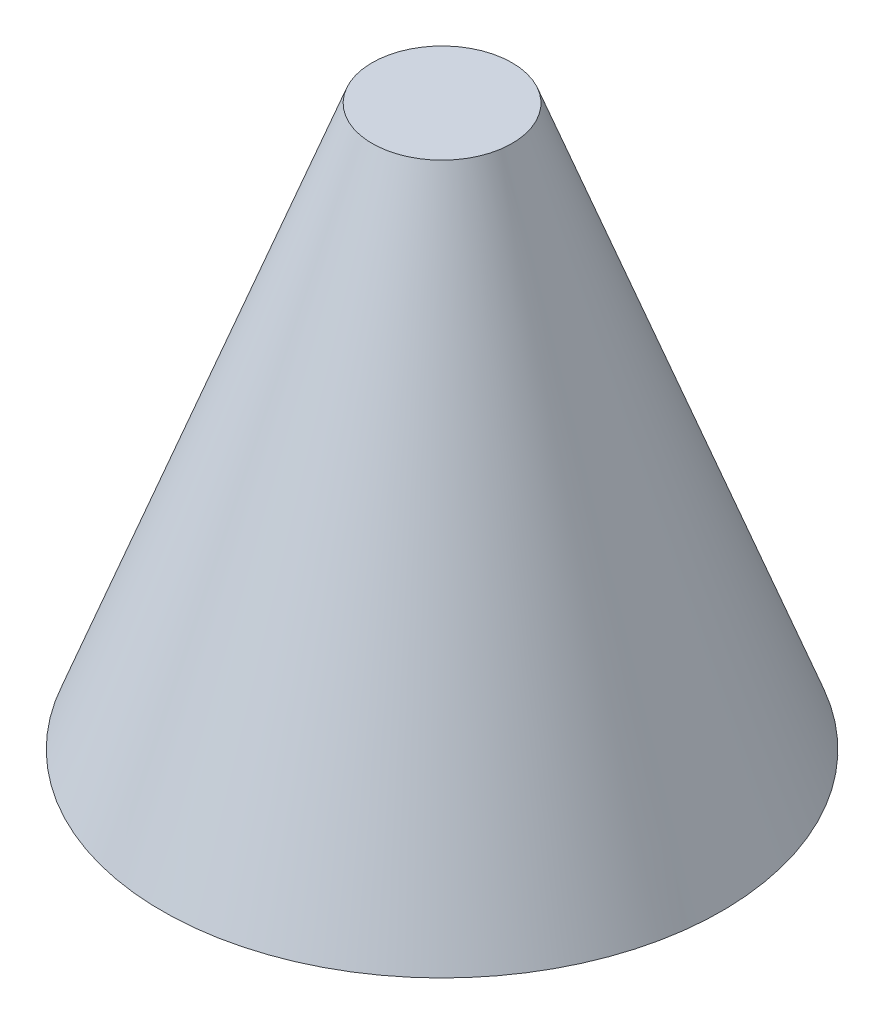
ISO-10303-21;
HEADER;
FILE_DESCRIPTION(('STEP AP214'),'2;1');
FILE_NAME('part.step','',(''),(''),'','','');
FILE_SCHEMA(('AUTOMOTIVE_DESIGN { 1 0 10303 214 1 1 1 1 }'));
ENDSEC;
DATA;
#1=APPLICATION_CONTEXT('core data for automotive mechanical design processes');
#2=APPLICATION_PROTOCOL_DEFINITION('international standard','automotive_design',2000,#1);
#3=PRODUCT_CONTEXT('',#1,'mechanical');
#4=PRODUCT('Part','Part','',(#3));
#5=PRODUCT_RELATED_PRODUCT_CATEGORY('part','',(#4));
#6=PRODUCT_DEFINITION_FORMATION('','',#4);
#7=PRODUCT_DEFINITION_CONTEXT('part definition',#1,'design');
#8=PRODUCT_DEFINITION('design','',#6,#7);
#9=PRODUCT_DEFINITION_SHAPE('','',#8);
#10=(LENGTH_UNIT() NAMED_UNIT(*) SI_UNIT(.MILLI.,.METRE.));
#11=(NAMED_UNIT(*) PLANE_ANGLE_UNIT() SI_UNIT($,.RADIAN.));
#12=(NAMED_UNIT(*) SI_UNIT($,.STERADIAN.) SOLID_ANGLE_UNIT());
#13=UNCERTAINTY_MEASURE_WITH_UNIT(LENGTH_MEASURE(1.E-05),#10,'distance_accuracy_value','');
#14=(GEOMETRIC_REPRESENTATION_CONTEXT(3) GLOBAL_UNCERTAINTY_ASSIGNED_CONTEXT((#13)) GLOBAL_UNIT_ASSIGNED_CONTEXT((#10,
#11,#12)) REPRESENTATION_CONTEXT('',''));
#15=CARTESIAN_POINT('',(0.,0.,0.));
#16=DIRECTION('',(0.,0.,1.));
#17=DIRECTION('',(1.,0.,0.));
#18=AXIS2_PLACEMENT_3D('',#15,#16,#17);
#19=CARTESIAN_POINT('',(0.,5.99999999999999,0.));
#20=DIRECTION('',(0.,-1.,0.));
#21=DIRECTION('',(0.,0.,-1.));
#22=AXIS2_PLACEMENT_3D('',#19,#20,#21);
#23=PLANE('',#22);
#24=CARTESIAN_POINT('',(0.,5.99999999999999,0.));
#25=DIRECTION('',(0.,-1.,0.));
#26=DIRECTION('',(0.,0.,-1.));
#27=AXIS2_PLACEMENT_3D('',#24,#25,#26);
#28=CIRCLE('',#27,0.75);
#29=CARTESIAN_POINT('',(0.,5.99999999999999,-0.75));
#30=VERTEX_POINT('',#29);
#31=EDGE_CURVE('E10',#30,#30,#28,.T.);
#32=ORIENTED_EDGE('',*,*,#31,.F.);
#33=EDGE_LOOP('',(#32));
#34=FACE_BOUND('',#33,.T.);
#35=ADVANCED_FACE('F29',(#34),#23,.F.);
#36=CARTESIAN_POINT('',(0.,5.99999999999999,0.));
#37=DIRECTION('',(0.,-1.,0.));
#38=DIRECTION('',(0.,0.,-1.));
#39=AXIS2_PLACEMENT_3D('',#36,#37,#38);
#40=CONICAL_SURFACE('',#39,0.75,0.358770670270572);
#41=CARTESIAN_POINT('',(0.,0.,0.));
#42=DIRECTION('',(0.,-1.,0.));
#43=DIRECTION('',(0.,0.,-1.));
#44=AXIS2_PLACEMENT_3D('',#41,#42,#43);
#45=CIRCLE('',#44,3.);
#46=CARTESIAN_POINT('',(0.,0.,-3.));
#47=VERTEX_POINT('',#46);
#48=EDGE_CURVE('E35',#47,#47,#45,.T.);
#49=CARTESIAN_POINT('',(0.,0.,-3.));
#50=CARTESIAN_POINT('',(0.,0.0625,-2.9765625));
#51=CARTESIAN_POINT('',(0.,0.125,-2.953125));
#52=CARTESIAN_POINT('',(0.,0.25,-2.90625));
#53=CARTESIAN_POINT('',(0.,0.3125,-2.8828125));
#54=CARTESIAN_POINT('',(0.,0.437499999999999,-2.8359375));
#55=CARTESIAN_POINT('',(0.,0.499999999999999,-2.8125));
#56=CARTESIAN_POINT('',(0.,0.624999999999999,-2.765625));
#57=CARTESIAN_POINT('',(0.,0.687499999999999,-2.7421875));
#58=CARTESIAN_POINT('',(0.,0.812499999999999,-2.6953125));
#59=CARTESIAN_POINT('',(0.,0.874999999999999,-2.671875));
#60=CARTESIAN_POINT('',(0.,0.999999999999999,-2.625));
#61=CARTESIAN_POINT('',(0.,1.0625,-2.6015625));
#62=CARTESIAN_POINT('',(0.,1.1875,-2.5546875));
#63=CARTESIAN_POINT('',(0.,1.25,-2.53125));
#64=CARTESIAN_POINT('',(0.,1.375,-2.484375));
#65=CARTESIAN_POINT('',(0.,1.4375,-2.4609375));
#66=CARTESIAN_POINT('',(0.,1.5625,-2.4140625));
#67=CARTESIAN_POINT('',(0.,1.625,-2.390625));
#68=CARTESIAN_POINT('',(0.,1.75,-2.34375));
#69=CARTESIAN_POINT('',(0.,1.8125,-2.3203125));
#70=CARTESIAN_POINT('',(0.,1.9375,-2.2734375));
#71=CARTESIAN_POINT('',(0.,2.,-2.25));
#72=CARTESIAN_POINT('',(0.,2.125,-2.203125));
#73=CARTESIAN_POINT('',(0.,2.1875,-2.1796875));
#74=CARTESIAN_POINT('',(0.,2.3125,-2.1328125));
#75=CARTESIAN_POINT('',(0.,2.375,-2.109375));
#76=CARTESIAN_POINT('',(0.,2.5,-2.0625));
#77=CARTESIAN_POINT('',(0.,2.5625,-2.0390625));
#78=CARTESIAN_POINT('',(0.,2.6875,-1.9921875));
#79=CARTESIAN_POINT('',(0.,2.75,-1.96875));
#80=CARTESIAN_POINT('',(0.,2.875,-1.921875));
#81=CARTESIAN_POINT('',(0.,2.9375,-1.8984375));
#82=CARTESIAN_POINT('',(0.,3.0625,-1.8515625));
#83=CARTESIAN_POINT('',(0.,3.125,-1.828125));
#84=CARTESIAN_POINT('',(0.,3.25,-1.78125));
#85=CARTESIAN_POINT('',(0.,3.3125,-1.7578125));
#86=CARTESIAN_POINT('',(0.,3.4375,-1.7109375));
#87=CARTESIAN_POINT('',(0.,3.49999999999999,-1.6875));
#88=CARTESIAN_POINT('',(0.,3.625,-1.640625));
#89=CARTESIAN_POINT('',(0.,3.68749999999999,-1.6171875));
#90=CARTESIAN_POINT('',(0.,3.81249999999999,-1.5703125));
#91=CARTESIAN_POINT('',(0.,3.87499999999999,-1.546875));
#92=CARTESIAN_POINT('',(0.,3.99999999999999,-1.5));
#93=CARTESIAN_POINT('',(0.,4.06249999999999,-1.4765625));
#94=CARTESIAN_POINT('',(0.,4.18749999999999,-1.4296875));
#95=CARTESIAN_POINT('',(0.,4.24999999999999,-1.40625));
#96=CARTESIAN_POINT('',(0.,4.37499999999999,-1.359375));
#97=CARTESIAN_POINT('',(0.,4.43749999999999,-1.3359375));
#98=CARTESIAN_POINT('',(0.,4.56249999999999,-1.2890625));
#99=CARTESIAN_POINT('',(0.,4.62499999999999,-1.265625));
#100=CARTESIAN_POINT('',(0.,4.74999999999999,-1.21875));
#101=CARTESIAN_POINT('',(0.,4.81249999999999,-1.1953125));
#102=CARTESIAN_POINT('',(0.,4.93749999999999,-1.1484375));
#103=CARTESIAN_POINT('',(0.,4.99999999999999,-1.125));
#104=CARTESIAN_POINT('',(0.,5.12499999999999,-1.078125));
#105=CARTESIAN_POINT('',(0.,5.18749999999999,-1.0546875));
#106=CARTESIAN_POINT('',(0.,5.31249999999999,-1.0078125));
#107=CARTESIAN_POINT('',(0.,5.37499999999999,-0.984375));
#108=CARTESIAN_POINT('',(0.,5.49999999999999,-0.9375));
#109=CARTESIAN_POINT('',(0.,5.56249999999999,-0.9140625));
#110=CARTESIAN_POINT('',(0.,5.68749999999999,-0.8671875));
#111=CARTESIAN_POINT('',(0.,5.74999999999999,-0.84375));
#112=CARTESIAN_POINT('',(0.,5.87499999999999,-0.796875));
#113=CARTESIAN_POINT('',(0.,5.93749999999999,-0.7734375));
#114=CARTESIAN_POINT('',(0.,5.99999999999999,-0.75));
#115=B_SPLINE_CURVE_WITH_KNOTS('',3,(#49,#50,#51,#52,#53,#54,#55,#56,#57,#58,#59,#60,#61,#62,
#63,#64,#65,#66,#67,#68,#69,#70,#71,#72,#73,#74,#75,#76,#77,#78,#79,#80,#81,#82,#83,#84,#85,#86,
#87,#88,#89,#90,#91,#92,#93,#94,#95,#96,#97,#98,#99,#100,#101,#102,#103,#104,#105,#106,#107,
#108,#109,#110,#111,#112,#113,#114),.UNSPECIFIED.,.F.,.F.,(4,2,2,2,2,2,2,2,2,2,2,2,2,2,2,2,2,2,
2,2,2,2,2,2,2,2,2,2,2,2,2,2,4),(0.,0.20025008778088,0.400500175561759,0.600750263342638,
0.801000351123517,1.0012504389044,1.20150052668528,1.40175061446615,1.60200070224703,
1.80225079002791,2.00250087780879,2.20275096558967,2.40300105337055,2.60325114115143,
2.80350122893231,3.00375131671319,3.20400140449407,3.40425149227495,3.60450158005583,
3.80475166783671,4.00500175561759,4.20525184339847,4.40550193117934,4.60575201896022,
4.8060021067411,5.00625219452198,5.20650228230286,5.40675237008374,5.60700245786462,
5.8072525456455,6.00750263342638,6.20775272120726,6.40800280898814),.UNSPECIFIED.);
#116=EDGE_CURVE('BSEAM43',#47,#30,#115,.T.);
#117=ORIENTED_EDGE('',*,*,#48,.F.);
#118=ORIENTED_EDGE('',*,*,#31,.T.);
#119=ORIENTED_EDGE('',*,*,#116,.T.);
#120=ORIENTED_EDGE('',*,*,#116,.F.);
#121=EDGE_LOOP('',(#117,#119,#118,#120));
#122=FACE_BOUND('',#121,.T.);
#123=ADVANCED_FACE('F43',(#122),#40,.T.);
#124=CARTESIAN_POINT('',(0.,0.,0.));
#125=DIRECTION('',(0.,1.,0.));
#126=DIRECTION('',(0.,0.,1.));
#127=AXIS2_PLACEMENT_3D('',#124,#125,#126);
#128=PLANE('',#127);
#129=ORIENTED_EDGE('',*,*,#48,.T.);
#130=EDGE_LOOP('',(#129));
#131=FACE_BOUND('',#130,.T.);
#132=ADVANCED_FACE('F41',(#131),#128,.F.);
#133=CLOSED_SHELL('',(#35,#123,#132));
#134=MANIFOLD_SOLID_BREP('B2',#133);
#135=ADVANCED_BREP_SHAPE_REPRESENTATION('',(#18,#134),#14);
#136=SHAPE_DEFINITION_REPRESENTATION(#9,#135);
ENDSEC;
END-ISO-10303-21;
